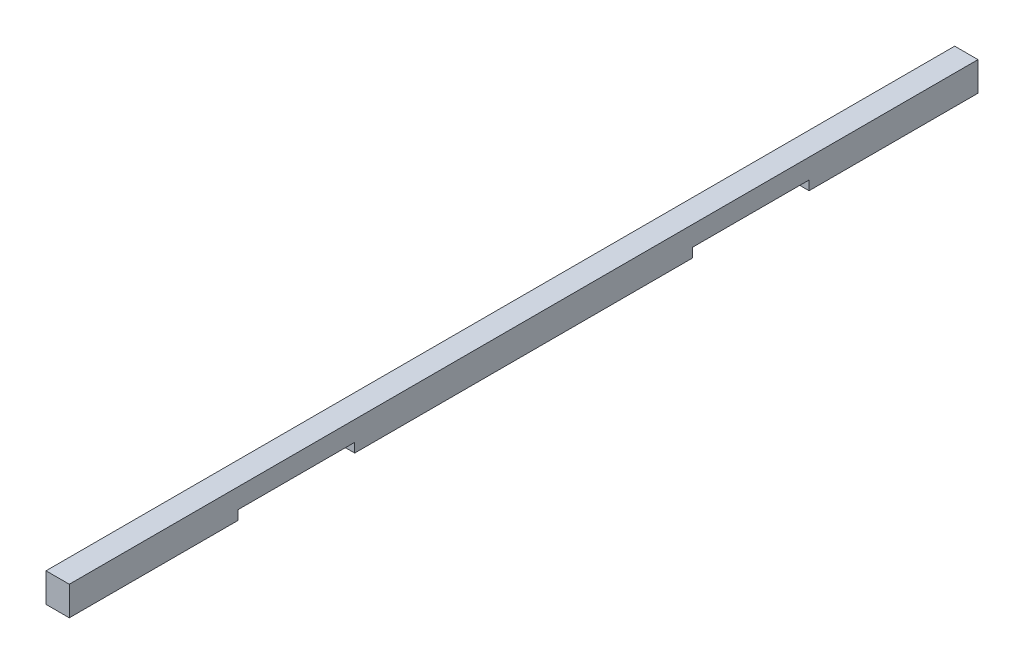
ISO-10303-21;
HEADER;
FILE_DESCRIPTION(('STEP AP214'),'2;1');
FILE_NAME('part.step','',(''),(''),'','','');
FILE_SCHEMA(('AUTOMOTIVE_DESIGN { 1 0 10303 214 1 1 1 1 }'));
ENDSEC;
DATA;
#1=APPLICATION_CONTEXT('core data for automotive mechanical design processes');
#2=APPLICATION_PROTOCOL_DEFINITION('international standard','automotive_design',2000,#1);
#3=PRODUCT_CONTEXT('',#1,'mechanical');
#4=PRODUCT('Part','Part','',(#3));
#5=PRODUCT_RELATED_PRODUCT_CATEGORY('part','',(#4));
#6=PRODUCT_DEFINITION_FORMATION('','',#4);
#7=PRODUCT_DEFINITION_CONTEXT('part definition',#1,'design');
#8=PRODUCT_DEFINITION('design','',#6,#7);
#9=PRODUCT_DEFINITION_SHAPE('','',#8);
#10=(LENGTH_UNIT() NAMED_UNIT(*) SI_UNIT(.MILLI.,.METRE.));
#11=(NAMED_UNIT(*) PLANE_ANGLE_UNIT() SI_UNIT($,.RADIAN.));
#12=(NAMED_UNIT(*) SI_UNIT($,.STERADIAN.) SOLID_ANGLE_UNIT());
#13=UNCERTAINTY_MEASURE_WITH_UNIT(LENGTH_MEASURE(1.E-05),#10,'distance_accuracy_value','');
#14=(GEOMETRIC_REPRESENTATION_CONTEXT(3) GLOBAL_UNCERTAINTY_ASSIGNED_CONTEXT((#13)) GLOBAL_UNIT_ASSIGNED_CONTEXT((#10,
#11,#12)) REPRESENTATION_CONTEXT('',''));
#15=CARTESIAN_POINT('',(0.,0.,0.));
#16=DIRECTION('',(0.,0.,1.));
#17=DIRECTION('',(1.,0.,0.));
#18=AXIS2_PLACEMENT_3D('',#15,#16,#17);
#19=CARTESIAN_POINT('',(0.,0.,-780.));
#20=DIRECTION('',(0.,-1.,0.));
#21=DIRECTION('',(0.,0.,-1.));
#22=AXIS2_PLACEMENT_3D('',#19,#20,#21);
#23=PLANE('',#22);
#24=DIRECTION('',(1.,0.,0.));
#25=VECTOR('',#24,1.);
#26=CARTESIAN_POINT('',(0.,0.,-535.));
#27=LINE('',#26,#25);
#28=CARTESIAN_POINT('',(0.,0.,-535.));
#29=VERTEX_POINT('',#28);
#30=CARTESIAN_POINT('',(20.,0.,-535.));
#31=VERTEX_POINT('',#30);
#32=EDGE_CURVE('E152',#29,#31,#27,.T.);
#33=ORIENTED_EDGE('',*,*,#32,.T.);
#34=DIRECTION('',(0.,0.,1.));
#35=VECTOR('',#34,1.);
#36=CARTESIAN_POINT('',(20.,0.,-780.));
#37=LINE('',#36,#35);
#38=CARTESIAN_POINT('',(20.,-1.2491397351303E-13,-245.));
#39=VERTEX_POINT('',#38);
#40=EDGE_CURVE('E209',#31,#39,#37,.T.);
#41=ORIENTED_EDGE('',*,*,#40,.T.);
#42=DIRECTION('',(1.,0.,0.));
#43=VECTOR('',#42,1.);
#44=CARTESIAN_POINT('',(0.,-1.2491397351303E-13,-245.));
#45=LINE('',#44,#43);
#46=CARTESIAN_POINT('',(0.,0.,-245.));
#47=VERTEX_POINT('',#46);
#48=EDGE_CURVE('E179',#47,#39,#45,.T.);
#49=ORIENTED_EDGE('',*,*,#48,.F.);
#50=DIRECTION('',(0.,0.,1.));
#51=VECTOR('',#50,1.);
#52=CARTESIAN_POINT('',(0.,0.,-780.));
#53=LINE('',#52,#51);
#54=EDGE_CURVE('E60',#29,#47,#53,.T.);
#55=ORIENTED_EDGE('',*,*,#54,.F.);
#56=EDGE_LOOP('',(#33,#41,#49,#55));
#57=FACE_BOUND('',#56,.T.);
#58=ADVANCED_FACE('F35',(#57),#23,.T.);
#59=DIRECTION('',(1.,0.,0.));
#60=VECTOR('',#59,1.);
#61=CARTESIAN_POINT('',(0.,-1.2491397351303E-13,-145.));
#62=LINE('',#61,#60);
#63=CARTESIAN_POINT('',(0.,-1.2491397351303E-13,-145.));
#64=VERTEX_POINT('',#63);
#65=CARTESIAN_POINT('',(20.,-1.2491397351303E-13,-145.));
#66=VERTEX_POINT('',#65);
#67=EDGE_CURVE('E167',#64,#66,#62,.T.);
#68=ORIENTED_EDGE('',*,*,#67,.T.);
#69=CARTESIAN_POINT('',(20.,0.,0.));
#70=VERTEX_POINT('',#69);
#71=EDGE_CURVE('E210',#66,#70,#37,.T.);
#72=ORIENTED_EDGE('',*,*,#71,.T.);
#73=DIRECTION('',(1.,0.,0.));
#74=VECTOR('',#73,1.);
#75=CARTESIAN_POINT('',(0.,0.,0.));
#76=LINE('',#75,#74);
#77=CARTESIAN_POINT('',(0.,0.,0.));
#78=VERTEX_POINT('',#77);
#79=EDGE_CURVE('E199',#78,#70,#76,.T.);
#80=ORIENTED_EDGE('',*,*,#79,.F.);
#81=EDGE_CURVE('E196',#64,#78,#53,.T.);
#82=ORIENTED_EDGE('',*,*,#81,.F.);
#83=EDGE_LOOP('',(#68,#72,#80,#82));
#84=FACE_BOUND('',#83,.T.);
#85=ADVANCED_FACE('F219',(#84),#23,.T.);
#86=CARTESIAN_POINT('',(0.,0.,-780.));
#87=DIRECTION('',(-1.,0.,0.));
#88=DIRECTION('',(0.,0.,1.));
#89=AXIS2_PLACEMENT_3D('',#86,#87,#88);
#90=PLANE('',#89);
#91=DIRECTION('',(0.,-1.,0.));
#92=VECTOR('',#91,1.);
#93=CARTESIAN_POINT('',(0.,0.,-535.));
#94=LINE('',#93,#92);
#95=CARTESIAN_POINT('',(0.,7.99999999999991,-535.));
#96=VERTEX_POINT('',#95);
#97=EDGE_CURVE('E140',#96,#29,#94,.T.);
#98=ORIENTED_EDGE('',*,*,#97,.T.);
#99=ORIENTED_EDGE('',*,*,#54,.T.);
#100=DIRECTION('',(0.,1.,0.));
#101=VECTOR('',#100,1.);
#102=CARTESIAN_POINT('',(0.,-1.2491397351303E-13,-245.));
#103=LINE('',#102,#101);
#104=CARTESIAN_POINT('',(0.,7.99999999999988,-245.));
#105=VERTEX_POINT('',#104);
#106=EDGE_CURVE('E161',#47,#105,#103,.T.);
#107=ORIENTED_EDGE('',*,*,#106,.T.);
#108=DIRECTION('',(0.,0.,1.));
#109=VECTOR('',#108,1.);
#110=CARTESIAN_POINT('',(0.,7.99999999999988,-145.));
#111=LINE('',#110,#109);
#112=CARTESIAN_POINT('',(0.,7.99999999999988,-145.));
#113=VERTEX_POINT('',#112);
#114=EDGE_CURVE('E164',#105,#113,#111,.T.);
#115=ORIENTED_EDGE('',*,*,#114,.T.);
#116=DIRECTION('',(0.,-1.,0.));
#117=VECTOR('',#116,1.);
#118=CARTESIAN_POINT('',(0.,-1.2491397351303E-13,-145.));
#119=LINE('',#118,#117);
#120=EDGE_CURVE('E158',#113,#64,#119,.T.);
#121=ORIENTED_EDGE('',*,*,#120,.T.);
#122=ORIENTED_EDGE('',*,*,#81,.T.);
#123=DIRECTION('',(0.,-1.,0.));
#124=VECTOR('',#123,1.);
#125=CARTESIAN_POINT('',(0.,0.,0.));
#126=LINE('',#125,#124);
#127=CARTESIAN_POINT('',(0.,25.,0.));
#128=VERTEX_POINT('',#127);
#129=EDGE_CURVE('E176',#128,#78,#126,.T.);
#130=ORIENTED_EDGE('',*,*,#129,.F.);
#131=DIRECTION('',(0.,0.,1.));
#132=VECTOR('',#131,1.);
#133=CARTESIAN_POINT('',(0.,25.,-780.));
#134=LINE('',#133,#132);
#135=CARTESIAN_POINT('',(0.,25.,-780.));
#136=VERTEX_POINT('',#135);
#137=EDGE_CURVE('E11',#136,#128,#134,.T.);
#138=ORIENTED_EDGE('',*,*,#137,.F.);
#139=DIRECTION('',(0.,-1.,0.));
#140=VECTOR('',#139,1.);
#141=CARTESIAN_POINT('',(0.,0.,-780.));
#142=LINE('',#141,#140);
#143=CARTESIAN_POINT('',(0.,0.,-780.));
#144=VERTEX_POINT('',#143);
#145=EDGE_CURVE('E184',#136,#144,#142,.T.);
#146=ORIENTED_EDGE('',*,*,#145,.T.);
#147=CARTESIAN_POINT('',(0.,0.,-635.));
#148=VERTEX_POINT('',#147);
#149=EDGE_CURVE('E39',#144,#148,#53,.T.);
#150=ORIENTED_EDGE('',*,*,#149,.T.);
#151=DIRECTION('',(0.,1.,0.));
#152=VECTOR('',#151,1.);
#153=CARTESIAN_POINT('',(0.,0.,-635.));
#154=LINE('',#153,#152);
#155=CARTESIAN_POINT('',(0.,7.99999999999994,-635.));
#156=VERTEX_POINT('',#155);
#157=EDGE_CURVE('E52',#148,#156,#154,.T.);
#158=ORIENTED_EDGE('',*,*,#157,.T.);
#159=DIRECTION('',(0.,0.,1.));
#160=VECTOR('',#159,1.);
#161=CARTESIAN_POINT('',(0.,7.99999999999994,-635.));
#162=LINE('',#161,#160);
#163=EDGE_CURVE('E137',#156,#96,#162,.T.);
#164=ORIENTED_EDGE('',*,*,#163,.T.);
#165=EDGE_LOOP('',(#98,#99,#107,#115,#121,#122,#130,#138,#146,#150,#158,#164));
#166=FACE_BOUND('',#165,.T.);
#167=ADVANCED_FACE('F37',(#166),#90,.T.);
#168=CARTESIAN_POINT('',(0.,25.,-780.));
#169=DIRECTION('',(0.,1.,0.));
#170=DIRECTION('',(0.,0.,1.));
#171=AXIS2_PLACEMENT_3D('',#168,#169,#170);
#172=PLANE('',#171);
#173=DIRECTION('',(-1.,0.,0.));
#174=VECTOR('',#173,1.);
#175=CARTESIAN_POINT('',(0.,25.,0.));
#176=LINE('',#175,#174);
#177=CARTESIAN_POINT('',(20.,25.,0.));
#178=VERTEX_POINT('',#177);
#179=EDGE_CURVE('E187',#178,#128,#176,.T.);
#180=ORIENTED_EDGE('',*,*,#179,.F.);
#181=DIRECTION('',(0.,0.,1.));
#182=VECTOR('',#181,1.);
#183=CARTESIAN_POINT('',(20.,25.,-780.));
#184=LINE('',#183,#182);
#185=CARTESIAN_POINT('',(20.,25.,-780.));
#186=VERTEX_POINT('',#185);
#187=EDGE_CURVE('E44',#186,#178,#184,.T.);
#188=ORIENTED_EDGE('',*,*,#187,.F.);
#189=DIRECTION('',(-1.,0.,0.));
#190=VECTOR('',#189,1.);
#191=CARTESIAN_POINT('',(0.,25.,-780.));
#192=LINE('',#191,#190);
#193=EDGE_CURVE('E193',#186,#136,#192,.T.);
#194=ORIENTED_EDGE('',*,*,#193,.T.);
#195=ORIENTED_EDGE('',*,*,#137,.T.);
#196=EDGE_LOOP('',(#180,#188,#194,#195));
#197=FACE_BOUND('',#196,.T.);
#198=ADVANCED_FACE('F224',(#197),#172,.T.);
#199=CARTESIAN_POINT('',(20.,0.,-780.));
#200=DIRECTION('',(1.,0.,0.));
#201=DIRECTION('',(0.,0.,-1.));
#202=AXIS2_PLACEMENT_3D('',#199,#200,#201);
#203=PLANE('',#202);
#204=DIRECTION('',(0.,-1.,0.));
#205=VECTOR('',#204,1.);
#206=CARTESIAN_POINT('',(20.,0.,-535.));
#207=LINE('',#206,#205);
#208=CARTESIAN_POINT('',(20.,7.99999999999991,-535.));
#209=VERTEX_POINT('',#208);
#210=EDGE_CURVE('E144',#209,#31,#207,.T.);
#211=ORIENTED_EDGE('',*,*,#210,.F.);
#212=DIRECTION('',(0.,0.,1.));
#213=VECTOR('',#212,1.);
#214=CARTESIAN_POINT('',(20.,7.99999999999994,-635.));
#215=LINE('',#214,#213);
#216=CARTESIAN_POINT('',(20.,7.99999999999994,-635.));
#217=VERTEX_POINT('',#216);
#218=EDGE_CURVE('E146',#217,#209,#215,.T.);
#219=ORIENTED_EDGE('',*,*,#218,.F.);
#220=DIRECTION('',(0.,1.,0.));
#221=VECTOR('',#220,1.);
#222=CARTESIAN_POINT('',(20.,0.,-635.));
#223=LINE('',#222,#221);
#224=CARTESIAN_POINT('',(20.,0.,-635.));
#225=VERTEX_POINT('',#224);
#226=EDGE_CURVE('E129',#225,#217,#223,.T.);
#227=ORIENTED_EDGE('',*,*,#226,.F.);
#228=CARTESIAN_POINT('',(20.,0.,-780.));
#229=VERTEX_POINT('',#228);
#230=EDGE_CURVE('E207',#229,#225,#37,.T.);
#231=ORIENTED_EDGE('',*,*,#230,.F.);
#232=DIRECTION('',(0.,1.,0.));
#233=VECTOR('',#232,1.);
#234=CARTESIAN_POINT('',(20.,0.,-780.));
#235=LINE('',#234,#233);
#236=EDGE_CURVE('E190',#229,#186,#235,.T.);
#237=ORIENTED_EDGE('',*,*,#236,.T.);
#238=ORIENTED_EDGE('',*,*,#187,.T.);
#239=DIRECTION('',(0.,1.,0.));
#240=VECTOR('',#239,1.);
#241=CARTESIAN_POINT('',(20.,0.,0.));
#242=LINE('',#241,#240);
#243=EDGE_CURVE('E202',#70,#178,#242,.T.);
#244=ORIENTED_EDGE('',*,*,#243,.F.);
#245=ORIENTED_EDGE('',*,*,#71,.F.);
#246=DIRECTION('',(0.,-1.,0.));
#247=VECTOR('',#246,1.);
#248=CARTESIAN_POINT('',(20.,-1.2491397351303E-13,-145.));
#249=LINE('',#248,#247);
#250=CARTESIAN_POINT('',(20.,7.99999999999988,-145.));
#251=VERTEX_POINT('',#250);
#252=EDGE_CURVE('E155',#251,#66,#249,.T.);
#253=ORIENTED_EDGE('',*,*,#252,.F.);
#254=DIRECTION('',(0.,0.,1.));
#255=VECTOR('',#254,1.);
#256=CARTESIAN_POINT('',(20.,7.99999999999988,-145.));
#257=LINE('',#256,#255);
#258=CARTESIAN_POINT('',(20.,7.99999999999988,-245.));
#259=VERTEX_POINT('',#258);
#260=EDGE_CURVE('E162',#259,#251,#257,.T.);
#261=ORIENTED_EDGE('',*,*,#260,.F.);
#262=DIRECTION('',(0.,1.,0.));
#263=VECTOR('',#262,1.);
#264=CARTESIAN_POINT('',(20.,-1.2491397351303E-13,-245.));
#265=LINE('',#264,#263);
#266=EDGE_CURVE('E169',#39,#259,#265,.T.);
#267=ORIENTED_EDGE('',*,*,#266,.F.);
#268=ORIENTED_EDGE('',*,*,#40,.F.);
#269=EDGE_LOOP('',(#211,#219,#227,#231,#237,#238,#244,#245,#253,#261,#267,#268));
#270=FACE_BOUND('',#269,.T.);
#271=ADVANCED_FACE('F234',(#270),#203,.T.);
#272=DIRECTION('',(1.,0.,0.));
#273=VECTOR('',#272,1.);
#274=CARTESIAN_POINT('',(0.,0.,-635.));
#275=LINE('',#274,#273);
#276=EDGE_CURVE('E134',#148,#225,#275,.T.);
#277=ORIENTED_EDGE('',*,*,#276,.F.);
#278=ORIENTED_EDGE('',*,*,#149,.F.);
#279=DIRECTION('',(1.,0.,0.));
#280=VECTOR('',#279,1.);
#281=CARTESIAN_POINT('',(0.,0.,-780.));
#282=LINE('',#281,#280);
#283=EDGE_CURVE('E186',#144,#229,#282,.T.);
#284=ORIENTED_EDGE('',*,*,#283,.T.);
#285=ORIENTED_EDGE('',*,*,#230,.T.);
#286=EDGE_LOOP('',(#277,#278,#284,#285));
#287=FACE_BOUND('',#286,.T.);
#288=ADVANCED_FACE('F231',(#287),#23,.T.);
#289=CARTESIAN_POINT('',(0.,0.,-780.));
#290=DIRECTION('',(0.,0.,-1.));
#291=DIRECTION('',(-1.,0.,0.));
#292=AXIS2_PLACEMENT_3D('',#289,#290,#291);
#293=PLANE('',#292);
#294=ORIENTED_EDGE('',*,*,#145,.F.);
#295=ORIENTED_EDGE('',*,*,#193,.F.);
#296=ORIENTED_EDGE('',*,*,#236,.F.);
#297=ORIENTED_EDGE('',*,*,#283,.F.);
#298=EDGE_LOOP('',(#294,#295,#296,#297));
#299=FACE_BOUND('',#298,.T.);
#300=ADVANCED_FACE('F229',(#299),#293,.T.);
#301=CARTESIAN_POINT('',(0.,0.,0.));
#302=DIRECTION('',(0.,0.,-1.));
#303=DIRECTION('',(-1.,0.,0.));
#304=AXIS2_PLACEMENT_3D('',#301,#302,#303);
#305=PLANE('',#304);
#306=ORIENTED_EDGE('',*,*,#129,.T.);
#307=ORIENTED_EDGE('',*,*,#79,.T.);
#308=ORIENTED_EDGE('',*,*,#243,.T.);
#309=ORIENTED_EDGE('',*,*,#179,.T.);
#310=EDGE_LOOP('',(#306,#307,#308,#309));
#311=FACE_BOUND('',#310,.T.);
#312=ADVANCED_FACE('F221',(#311),#305,.F.);
#313=CARTESIAN_POINT('',(0.,-1.2491397351303E-13,-145.));
#314=DIRECTION('',(0.,0.,1.));
#315=DIRECTION('',(0.,-1.,0.));
#316=AXIS2_PLACEMENT_3D('',#313,#314,#315);
#317=PLANE('',#316);
#318=ORIENTED_EDGE('',*,*,#252,.T.);
#319=ORIENTED_EDGE('',*,*,#67,.F.);
#320=ORIENTED_EDGE('',*,*,#120,.F.);
#321=DIRECTION('',(1.,0.,0.));
#322=VECTOR('',#321,1.);
#323=CARTESIAN_POINT('',(0.,7.99999999999988,-145.));
#324=LINE('',#323,#322);
#325=EDGE_CURVE('E174',#113,#251,#324,.T.);
#326=ORIENTED_EDGE('',*,*,#325,.T.);
#327=EDGE_LOOP('',(#318,#319,#320,#326));
#328=FACE_BOUND('',#327,.T.);
#329=ADVANCED_FACE('F249',(#328),#317,.F.);
#330=CARTESIAN_POINT('',(0.,7.99999999999988,-145.));
#331=DIRECTION('',(0.,1.,0.));
#332=DIRECTION('',(0.,0.,1.));
#333=AXIS2_PLACEMENT_3D('',#330,#331,#332);
#334=PLANE('',#333);
#335=ORIENTED_EDGE('',*,*,#260,.T.);
#336=ORIENTED_EDGE('',*,*,#325,.F.);
#337=ORIENTED_EDGE('',*,*,#114,.F.);
#338=DIRECTION('',(1.,0.,0.));
#339=VECTOR('',#338,1.);
#340=CARTESIAN_POINT('',(0.,7.99999999999988,-245.));
#341=LINE('',#340,#339);
#342=EDGE_CURVE('E177',#105,#259,#341,.T.);
#343=ORIENTED_EDGE('',*,*,#342,.T.);
#344=EDGE_LOOP('',(#335,#336,#337,#343));
#345=FACE_BOUND('',#344,.T.);
#346=ADVANCED_FACE('F246',(#345),#334,.F.);
#347=CARTESIAN_POINT('',(0.,-1.2491397351303E-13,-245.));
#348=DIRECTION('',(0.,0.,-1.));
#349=DIRECTION('',(-1.,0.,0.));
#350=AXIS2_PLACEMENT_3D('',#347,#348,#349);
#351=PLANE('',#350);
#352=ORIENTED_EDGE('',*,*,#266,.T.);
#353=ORIENTED_EDGE('',*,*,#342,.F.);
#354=ORIENTED_EDGE('',*,*,#106,.F.);
#355=ORIENTED_EDGE('',*,*,#48,.T.);
#356=EDGE_LOOP('',(#352,#353,#354,#355));
#357=FACE_BOUND('',#356,.T.);
#358=ADVANCED_FACE('F242',(#357),#351,.F.);
#359=CARTESIAN_POINT('',(0.,0.,-535.));
#360=DIRECTION('',(0.,0.,1.));
#361=DIRECTION('',(1.,0.,0.));
#362=AXIS2_PLACEMENT_3D('',#359,#360,#361);
#363=PLANE('',#362);
#364=ORIENTED_EDGE('',*,*,#210,.T.);
#365=ORIENTED_EDGE('',*,*,#32,.F.);
#366=ORIENTED_EDGE('',*,*,#97,.F.);
#367=DIRECTION('',(1.,0.,0.));
#368=VECTOR('',#367,1.);
#369=CARTESIAN_POINT('',(0.,7.99999999999991,-535.));
#370=LINE('',#369,#368);
#371=EDGE_CURVE('E133',#96,#209,#370,.T.);
#372=ORIENTED_EDGE('',*,*,#371,.T.);
#373=EDGE_LOOP('',(#364,#365,#366,#372));
#374=FACE_BOUND('',#373,.T.);
#375=ADVANCED_FACE('F238',(#374),#363,.F.);
#376=CARTESIAN_POINT('',(0.,7.99999999999994,-635.));
#377=DIRECTION('',(0.,1.,0.));
#378=DIRECTION('',(0.,0.,1.));
#379=AXIS2_PLACEMENT_3D('',#376,#377,#378);
#380=PLANE('',#379);
#381=ORIENTED_EDGE('',*,*,#218,.T.);
#382=ORIENTED_EDGE('',*,*,#371,.F.);
#383=ORIENTED_EDGE('',*,*,#163,.F.);
#384=DIRECTION('',(1.,0.,0.));
#385=VECTOR('',#384,1.);
#386=CARTESIAN_POINT('',(0.,7.99999999999994,-635.));
#387=LINE('',#386,#385);
#388=EDGE_CURVE('E125',#156,#217,#387,.T.);
#389=ORIENTED_EDGE('',*,*,#388,.T.);
#390=EDGE_LOOP('',(#381,#382,#383,#389));
#391=FACE_BOUND('',#390,.T.);
#392=ADVANCED_FACE('F138',(#391),#380,.F.);
#393=CARTESIAN_POINT('',(0.,0.,-635.));
#394=DIRECTION('',(0.,0.,-1.));
#395=DIRECTION('',(-1.,0.,0.));
#396=AXIS2_PLACEMENT_3D('',#393,#394,#395);
#397=PLANE('',#396);
#398=ORIENTED_EDGE('',*,*,#226,.T.);
#399=ORIENTED_EDGE('',*,*,#388,.F.);
#400=ORIENTED_EDGE('',*,*,#157,.F.);
#401=ORIENTED_EDGE('',*,*,#276,.T.);
#402=EDGE_LOOP('',(#398,#399,#400,#401));
#403=FACE_BOUND('',#402,.T.);
#404=ADVANCED_FACE('F127',(#403),#397,.F.);
#405=CLOSED_SHELL('',(#58,#85,#167,#198,#271,#288,#300,#312,#329,#346,#358,#375,#392,#404));
#406=MANIFOLD_SOLID_BREP('B2',#405);
#407=ADVANCED_BREP_SHAPE_REPRESENTATION('',(#18,#406),#14);
#408=SHAPE_DEFINITION_REPRESENTATION(#9,#407);
ENDSEC;
END-ISO-10303-21;
